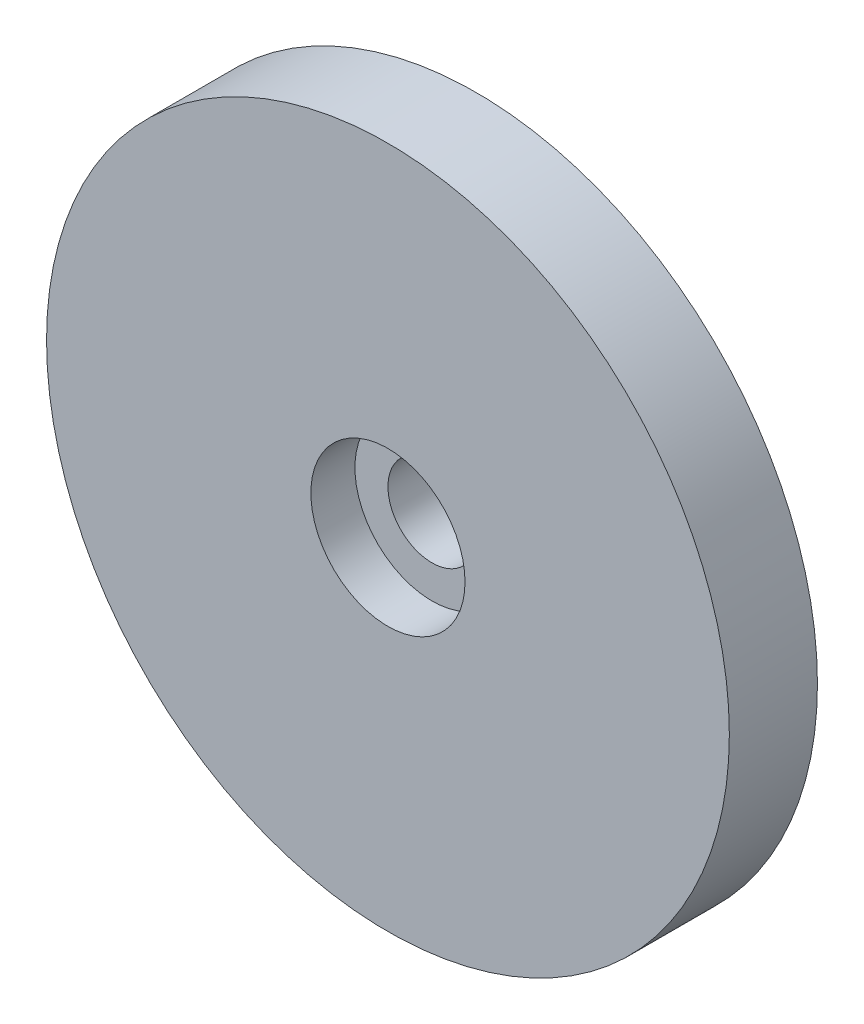
ISO-10303-21;
HEADER;
FILE_DESCRIPTION(('STEP AP214'),'2;1');
FILE_NAME('part.step','',(''),(''),'','','');
FILE_SCHEMA(('AUTOMOTIVE_DESIGN { 1 0 10303 214 1 1 1 1 }'));
ENDSEC;
DATA;
#1=APPLICATION_CONTEXT('core data for automotive mechanical design processes');
#2=APPLICATION_PROTOCOL_DEFINITION('international standard','automotive_design',2000,#1);
#3=PRODUCT_CONTEXT('',#1,'mechanical');
#4=PRODUCT('Part','Part','',(#3));
#5=PRODUCT_RELATED_PRODUCT_CATEGORY('part','',(#4));
#6=PRODUCT_DEFINITION_FORMATION('','',#4);
#7=PRODUCT_DEFINITION_CONTEXT('part definition',#1,'design');
#8=PRODUCT_DEFINITION('design','',#6,#7);
#9=PRODUCT_DEFINITION_SHAPE('','',#8);
#10=(LENGTH_UNIT() NAMED_UNIT(*) SI_UNIT(.MILLI.,.METRE.));
#11=(NAMED_UNIT(*) PLANE_ANGLE_UNIT() SI_UNIT($,.RADIAN.));
#12=(NAMED_UNIT(*) SI_UNIT($,.STERADIAN.) SOLID_ANGLE_UNIT());
#13=UNCERTAINTY_MEASURE_WITH_UNIT(LENGTH_MEASURE(1.E-05),#10,'distance_accuracy_value','');
#14=(GEOMETRIC_REPRESENTATION_CONTEXT(3) GLOBAL_UNCERTAINTY_ASSIGNED_CONTEXT((#13)) GLOBAL_UNIT_ASSIGNED_CONTEXT((#10,
#11,#12)) REPRESENTATION_CONTEXT('',''));
#15=CARTESIAN_POINT('',(0.,0.,0.));
#16=DIRECTION('',(0.,0.,1.));
#17=DIRECTION('',(1.,0.,0.));
#18=AXIS2_PLACEMENT_3D('',#15,#16,#17);
#19=CARTESIAN_POINT('',(0.,0.,0.));
#20=DIRECTION('',(0.,0.,1.));
#21=DIRECTION('',(1.,0.,0.));
#22=AXIS2_PLACEMENT_3D('',#19,#20,#21);
#23=CYLINDRICAL_SURFACE('',#22,1.);
#24=CARTESIAN_POINT('',(0.,0.,0.));
#25=DIRECTION('',(0.,0.,1.));
#26=DIRECTION('',(1.,0.,0.));
#27=AXIS2_PLACEMENT_3D('',#24,#25,#26);
#28=CIRCLE('',#27,1.);
#29=CARTESIAN_POINT('',(1.,0.,0.));
#30=VERTEX_POINT('',#29);
#31=EDGE_CURVE('E48',#30,#30,#28,.T.);
#32=ORIENTED_EDGE('',*,*,#31,.F.);
#33=EDGE_LOOP('',(#32));
#34=FACE_BOUND('',#33,.T.);
#35=CARTESIAN_POINT('',(0.,0.,1.));
#36=DIRECTION('',(0.,0.,1.));
#37=DIRECTION('',(1.,0.,0.));
#38=AXIS2_PLACEMENT_3D('',#35,#36,#37);
#39=CIRCLE('',#38,1.);
#40=CARTESIAN_POINT('',(1.,0.,1.));
#41=VERTEX_POINT('',#40);
#42=EDGE_CURVE('E56',#41,#41,#39,.T.);
#43=ORIENTED_EDGE('',*,*,#42,.T.);
#44=EDGE_LOOP('',(#43));
#45=FACE_BOUND('',#44,.T.);
#46=ADVANCED_FACE('F37',(#34,#45),#23,.F.);
#47=CARTESIAN_POINT('',(0.,0.,2.));
#48=DIRECTION('',(0.,0.,-1.));
#49=DIRECTION('',(-1.,0.,0.));
#50=AXIS2_PLACEMENT_3D('',#47,#48,#49);
#51=CYLINDRICAL_SURFACE('',#50,7.75);
#52=CARTESIAN_POINT('',(0.,0.,2.));
#53=DIRECTION('',(0.,0.,1.));
#54=DIRECTION('',(1.,0.,0.));
#55=AXIS2_PLACEMENT_3D('',#52,#53,#54);
#56=CIRCLE('',#55,7.75);
#57=CARTESIAN_POINT('',(7.75,0.,2.));
#58=VERTEX_POINT('',#57);
#59=EDGE_CURVE('E10',#58,#58,#56,.T.);
#60=ORIENTED_EDGE('',*,*,#59,.F.);
#61=EDGE_LOOP('',(#60));
#62=FACE_BOUND('',#61,.T.);
#63=CARTESIAN_POINT('',(0.,0.,0.));
#64=DIRECTION('',(0.,0.,1.));
#65=DIRECTION('',(1.,0.,0.));
#66=AXIS2_PLACEMENT_3D('',#63,#64,#65);
#67=CIRCLE('',#66,7.75);
#68=CARTESIAN_POINT('',(7.75,0.,0.));
#69=VERTEX_POINT('',#68);
#70=EDGE_CURVE('E41',#69,#69,#67,.T.);
#71=ORIENTED_EDGE('',*,*,#70,.T.);
#72=EDGE_LOOP('',(#71));
#73=FACE_BOUND('',#72,.T.);
#74=ADVANCED_FACE('F39',(#62,#73),#51,.T.);
#75=CARTESIAN_POINT('',(0.,0.,2.));
#76=DIRECTION('',(0.,0.,1.));
#77=DIRECTION('',(1.,0.,0.));
#78=AXIS2_PLACEMENT_3D('',#75,#76,#77);
#79=PLANE('',#78);
#80=CARTESIAN_POINT('',(0.,0.,2.));
#81=DIRECTION('',(0.,0.,1.));
#82=DIRECTION('',(1.,0.,0.));
#83=AXIS2_PLACEMENT_3D('',#80,#81,#82);
#84=CIRCLE('',#83,1.75);
#85=CARTESIAN_POINT('',(1.75,0.,2.));
#86=VERTEX_POINT('',#85);
#87=EDGE_CURVE('E53',#86,#86,#84,.T.);
#88=ORIENTED_EDGE('',*,*,#87,.F.);
#89=EDGE_LOOP('',(#88));
#90=FACE_BOUND('',#89,.T.);
#91=ORIENTED_EDGE('',*,*,#59,.T.);
#92=EDGE_LOOP('',(#91));
#93=FACE_BOUND('',#92,.T.);
#94=ADVANCED_FACE('F76',(#90,#93),#79,.T.);
#95=CARTESIAN_POINT('',(0.,0.,0.));
#96=DIRECTION('',(0.,0.,1.));
#97=DIRECTION('',(1.,0.,0.));
#98=AXIS2_PLACEMENT_3D('',#95,#96,#97);
#99=PLANE('',#98);
#100=ORIENTED_EDGE('',*,*,#31,.T.);
#101=EDGE_LOOP('',(#100));
#102=FACE_BOUND('',#101,.T.);
#103=ORIENTED_EDGE('',*,*,#70,.F.);
#104=EDGE_LOOP('',(#103));
#105=FACE_BOUND('',#104,.T.);
#106=ADVANCED_FACE('F72',(#102,#105),#99,.F.);
#107=CARTESIAN_POINT('',(0.,0.,1.));
#108=DIRECTION('',(0.,0.,1.));
#109=DIRECTION('',(1.,0.,0.));
#110=AXIS2_PLACEMENT_3D('',#107,#108,#109);
#111=CYLINDRICAL_SURFACE('',#110,1.75);
#112=CARTESIAN_POINT('',(0.,0.,1.));
#113=DIRECTION('',(0.,0.,1.));
#114=DIRECTION('',(1.,0.,0.));
#115=AXIS2_PLACEMENT_3D('',#112,#113,#114);
#116=CIRCLE('',#115,1.75);
#117=CARTESIAN_POINT('',(1.75,0.,1.));
#118=VERTEX_POINT('',#117);
#119=EDGE_CURVE('E52',#118,#118,#116,.T.);
#120=ORIENTED_EDGE('',*,*,#119,.F.);
#121=EDGE_LOOP('',(#120));
#122=FACE_BOUND('',#121,.T.);
#123=ORIENTED_EDGE('',*,*,#87,.T.);
#124=EDGE_LOOP('',(#123));
#125=FACE_BOUND('',#124,.T.);
#126=ADVANCED_FACE('F66',(#122,#125),#111,.F.);
#127=CARTESIAN_POINT('',(0.,0.,1.));
#128=DIRECTION('',(0.,0.,1.));
#129=DIRECTION('',(1.,0.,0.));
#130=AXIS2_PLACEMENT_3D('',#127,#128,#129);
#131=PLANE('',#130);
#132=ORIENTED_EDGE('',*,*,#42,.F.);
#133=EDGE_LOOP('',(#132));
#134=FACE_BOUND('',#133,.T.);
#135=ORIENTED_EDGE('',*,*,#119,.T.);
#136=EDGE_LOOP('',(#135));
#137=FACE_BOUND('',#136,.T.);
#138=ADVANCED_FACE('F63',(#134,#137),#131,.T.);
#139=CLOSED_SHELL('',(#46,#74,#94,#106,#126,#138));
#140=MANIFOLD_SOLID_BREP('B2',#139);
#141=ADVANCED_BREP_SHAPE_REPRESENTATION('',(#18,#140),#14);
#142=SHAPE_DEFINITION_REPRESENTATION(#9,#141);
ENDSEC;
END-ISO-10303-21;
